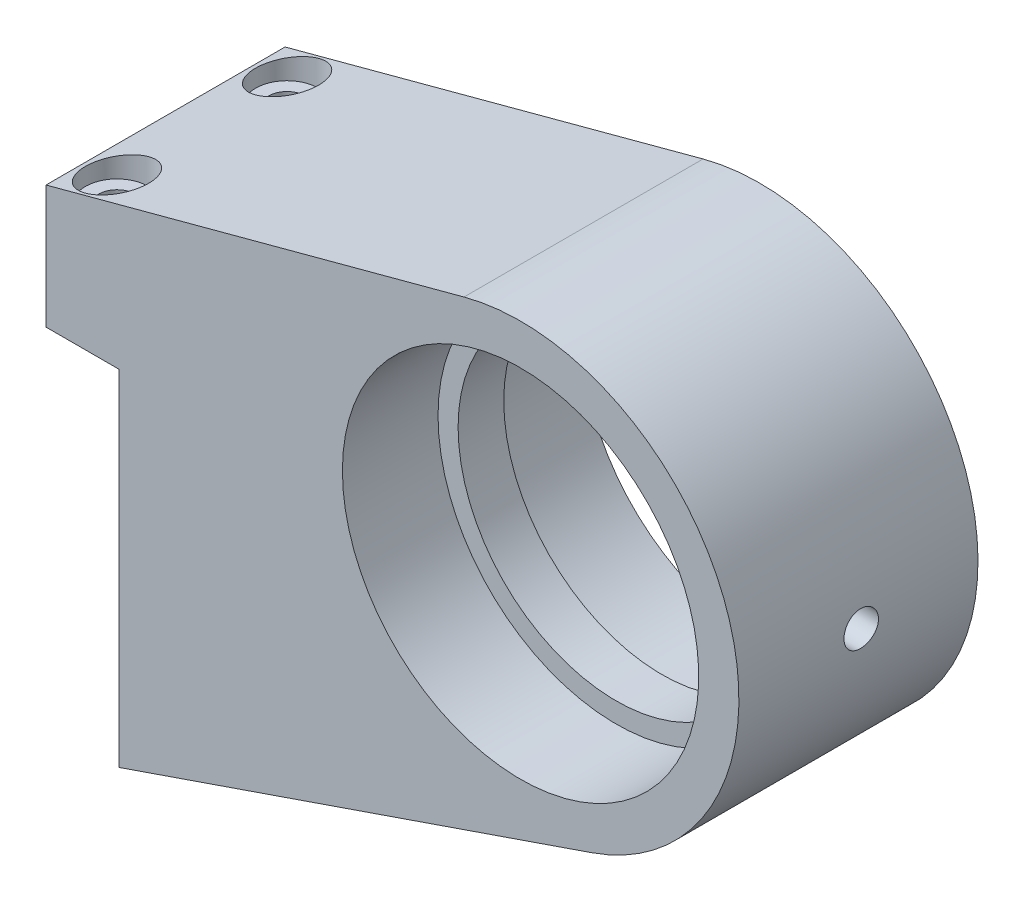
ISO-10303-21;
HEADER;
FILE_DESCRIPTION(('STEP AP214'),'2;1');
FILE_NAME('part.step','',(''),(''),'','','');
FILE_SCHEMA(('AUTOMOTIVE_DESIGN { 1 0 10303 214 1 1 1 1 }'));
ENDSEC;
DATA;
#1=APPLICATION_CONTEXT('core data for automotive mechanical design processes');
#2=APPLICATION_PROTOCOL_DEFINITION('international standard','automotive_design',2000,#1);
#3=PRODUCT_CONTEXT('',#1,'mechanical');
#4=PRODUCT('Part','Part','',(#3));
#5=PRODUCT_RELATED_PRODUCT_CATEGORY('part','',(#4));
#6=PRODUCT_DEFINITION_FORMATION('','',#4);
#7=PRODUCT_DEFINITION_CONTEXT('part definition',#1,'design');
#8=PRODUCT_DEFINITION('design','',#6,#7);
#9=PRODUCT_DEFINITION_SHAPE('','',#8);
#10=(LENGTH_UNIT() NAMED_UNIT(*) SI_UNIT(.MILLI.,.METRE.));
#11=(NAMED_UNIT(*) PLANE_ANGLE_UNIT() SI_UNIT($,.RADIAN.));
#12=(NAMED_UNIT(*) SI_UNIT($,.STERADIAN.) SOLID_ANGLE_UNIT());
#13=UNCERTAINTY_MEASURE_WITH_UNIT(LENGTH_MEASURE(1.E-05),#10,'distance_accuracy_value','');
#14=(GEOMETRIC_REPRESENTATION_CONTEXT(3) GLOBAL_UNCERTAINTY_ASSIGNED_CONTEXT((#13)) GLOBAL_UNIT_ASSIGNED_CONTEXT((#10,
#11,#12)) REPRESENTATION_CONTEXT('',''));
#15=CARTESIAN_POINT('',(0.,0.,0.));
#16=DIRECTION('',(0.,0.,1.));
#17=DIRECTION('',(1.,0.,0.));
#18=AXIS2_PLACEMENT_3D('',#15,#16,#17);
#19=CARTESIAN_POINT('',(-210.619690711645,105.906843019026,41.6));
#20=DIRECTION('',(1.,0.,0.));
#21=DIRECTION('',(0.,0.,-1.));
#22=AXIS2_PLACEMENT_3D('',#19,#20,#21);
#23=PLANE('',#22);
#24=DIRECTION('',(0.,0.,-1.));
#25=VECTOR('',#24,1.);
#26=CARTESIAN_POINT('',(-210.619690711645,105.906843019026,32.5053390593276));
#27=LINE('',#26,#25);
#28=CARTESIAN_POINT('',(-210.619690711645,105.906843019026,41.6));
#29=VERTEX_POINT('',#28);
#30=CARTESIAN_POINT('',(-210.619690711645,105.906843019026,0.));
#31=VERTEX_POINT('',#30);
#32=EDGE_CURVE('E98',#29,#31,#27,.T.);
#33=ORIENTED_EDGE('',*,*,#32,.F.);
#34=DIRECTION('',(0.,-1.,0.));
#35=VECTOR('',#34,1.);
#36=CARTESIAN_POINT('',(-210.619690711645,105.906843019026,41.6));
#37=LINE('',#36,#35);
#38=CARTESIAN_POINT('',(-210.619690711645,127.324395561206,41.6));
#39=VERTEX_POINT('',#38);
#40=EDGE_CURVE('E691',#39,#29,#37,.T.);
#41=ORIENTED_EDGE('',*,*,#40,.F.);
#42=DIRECTION('',(0.,0.,1.));
#43=VECTOR('',#42,1.);
#44=CARTESIAN_POINT('',(-210.619690711645,127.324395561206,41.6));
#45=LINE('',#44,#43);
#46=CARTESIAN_POINT('',(-210.619690711645,127.324395561206,0.));
#47=VERTEX_POINT('',#46);
#48=EDGE_CURVE('E82',#39,#47,#45,.F.);
#49=ORIENTED_EDGE('',*,*,#48,.T.);
#50=DIRECTION('',(0.,1.,0.));
#51=VECTOR('',#50,1.);
#52=CARTESIAN_POINT('',(-210.619690711645,105.906843019026,0.));
#53=LINE('',#52,#51);
#54=EDGE_CURVE('E328',#31,#47,#53,.T.);
#55=ORIENTED_EDGE('',*,*,#54,.F.);
#56=EDGE_LOOP('',(#33,#41,#49,#55));
#57=FACE_BOUND('',#56,.T.);
#58=ADVANCED_FACE('F44',(#57),#23,.F.);
#59=CARTESIAN_POINT('',(-90.0503522781823,78.412182078353,0.));
#60=DIRECTION('',(0.,0.707106781186552,0.707106781186544));
#61=DIRECTION('',(0.,-0.707106781186544,0.707106781186552));
#62=AXIS2_PLACEMENT_3D('',#59,#60,#61);
#63=PLANE('',#62);
#64=DIRECTION('',(0.,-0.707106781186543,0.707106781186552));
#65=VECTOR('',#64,1.);
#66=CARTESIAN_POINT('',(-197.919690711645,78.412182078353,0.));
#67=LINE('',#66,#65);
#68=CARTESIAN_POINT('',(-197.919690711645,78.412182078353,0.));
#69=VERTEX_POINT('',#68);
#70=CARTESIAN_POINT('',(-197.919690711645,45.9068430190258,32.5053390593276));
#71=VERTEX_POINT('',#70);
#72=EDGE_CURVE('E326',#69,#71,#67,.T.);
#73=ORIENTED_EDGE('',*,*,#72,.F.);
#74=DIRECTION('',(1.,0.,0.));
#75=VECTOR('',#74,1.);
#76=CARTESIAN_POINT('',(-128.050352278182,78.412182078353,0.));
#77=LINE('',#76,#75);
#78=CARTESIAN_POINT('',(-107.089511335592,78.412182078353,0.));
#79=VERTEX_POINT('',#78);
#80=EDGE_CURVE('E321',#69,#79,#77,.T.);
#81=ORIENTED_EDGE('',*,*,#80,.T.);
#82=CARTESIAN_POINT('',(-128.050352278182,110.108288258441,-31.6961061800888));
#83=DIRECTION('',(0.,0.707106781186552,0.707106781186544));
#84=DIRECTION('',(0.,0.707106781186544,-0.707106781186552));
#85=AXIS2_PLACEMENT_3D('',#82,#83,#84);
#86=ELLIPSE('',#85,53.7401153701779,38.);
#87=CARTESIAN_POINT('',(-115.696768034029,74.1723875973671,4.23979448098595));
#88=VERTEX_POINT('',#87);
#89=EDGE_CURVE('E336',#88,#79,#86,.T.);
#90=ORIENTED_EDGE('',*,*,#89,.F.);
#91=DIRECTION('',(-0.899350477500135,-0.309167202837135,0.309167202837139));
#92=VECTOR('',#91,1.);
#93=CARTESIAN_POINT('',(-115.696768034029,74.1723875973671,4.23979448098592));
#94=LINE('',#93,#92);
#95=EDGE_CURVE('E282',#88,#71,#94,.T.);
#96=ORIENTED_EDGE('',*,*,#95,.T.);
#97=EDGE_LOOP('',(#73,#81,#90,#96));
#98=FACE_BOUND('',#97,.T.);
#99=ADVANCED_FACE('F46',(#98),#63,.F.);
#100=CARTESIAN_POINT('',(-128.050352278182,110.108288258441,0.));
#101=DIRECTION('',(0.,0.,1.));
#102=DIRECTION('',(1.,0.,0.));
#103=AXIS2_PLACEMENT_3D('',#100,#101,#102);
#104=PLANE('',#103);
#105=CARTESIAN_POINT('',(-190.410297250705,84.4801271268031,0.));
#106=DIRECTION('',(0.,0.,-1.));
#107=DIRECTION('',(-1.,0.,0.));
#108=AXIS2_PLACEMENT_3D('',#105,#106,#107);
#109=CIRCLE('',#108,1.25);
#110=CARTESIAN_POINT('',(-191.660297250705,84.4801271268031,0.));
#111=VERTEX_POINT('',#110);
#112=EDGE_CURVE('E145',#111,#111,#109,.T.);
#113=ORIENTED_EDGE('',*,*,#112,.F.);
#114=EDGE_LOOP('',(#113));
#115=FACE_BOUND('',#114,.T.);
#116=CARTESIAN_POINT('',(-180.210297250705,106.730127126803,0.));
#117=DIRECTION('',(0.,0.,-1.));
#118=DIRECTION('',(-1.,0.,0.));
#119=AXIS2_PLACEMENT_3D('',#116,#117,#118);
#120=CIRCLE('',#119,1.25);
#121=CARTESIAN_POINT('',(-181.460297250705,106.730127126803,0.));
#122=VERTEX_POINT('',#121);
#123=EDGE_CURVE('E144',#122,#122,#120,.T.);
#124=ORIENTED_EDGE('',*,*,#123,.F.);
#125=EDGE_LOOP('',(#124));
#126=FACE_BOUND('',#125,.T.);
#127=CARTESIAN_POINT('',(-128.044290711645,110.052395561206,0.));
#128=DIRECTION('',(0.,0.,-1.));
#129=DIRECTION('',(-1.,0.,0.));
#130=AXIS2_PLACEMENT_3D('',#127,#128,#129);
#131=CIRCLE('',#130,31.0007);
#132=CARTESIAN_POINT('',(-159.044990711645,110.052395561206,0.));
#133=VERTEX_POINT('',#132);
#134=EDGE_CURVE('E632',#133,#133,#131,.T.);
#135=ORIENTED_EDGE('',*,*,#134,.F.);
#136=EDGE_LOOP('',(#135));
#137=FACE_BOUND('',#136,.T.);
#138=ORIENTED_EDGE('',*,*,#80,.F.);
#139=DIRECTION('',(0.,-1.,0.));
#140=VECTOR('',#139,1.);
#141=CARTESIAN_POINT('',(-197.919690711645,105.906843019026,0.));
#142=LINE('',#141,#140);
#143=CARTESIAN_POINT('',(-197.919690711645,105.906843019026,0.));
#144=VERTEX_POINT('',#143);
#145=EDGE_CURVE('E90',#144,#69,#142,.T.);
#146=ORIENTED_EDGE('',*,*,#145,.F.);
#147=DIRECTION('',(1.,0.,0.));
#148=VECTOR('',#147,1.);
#149=CARTESIAN_POINT('',(-210.619690711645,105.906843019026,0.));
#150=LINE('',#149,#148);
#151=EDGE_CURVE('E643',#31,#144,#150,.T.);
#152=ORIENTED_EDGE('',*,*,#151,.F.);
#153=ORIENTED_EDGE('',*,*,#54,.T.);
#154=DIRECTION('',(0.965925826289069,0.258819045102518,0.));
#155=VECTOR('',#154,1.);
#156=CARTESIAN_POINT('',(-210.619690711645,127.324395561206,0.));
#157=LINE('',#156,#155);
#158=CARTESIAN_POINT('',(-137.885475992078,146.813469657426,0.));
#159=VERTEX_POINT('',#158);
#160=EDGE_CURVE('E284',#47,#159,#157,.T.);
#161=ORIENTED_EDGE('',*,*,#160,.T.);
#162=CARTESIAN_POINT('',(-128.050352278182,110.108288258441,0.));
#163=DIRECTION('',(0.,0.,-1.));
#164=DIRECTION('',(-1.,0.,0.));
#165=AXIS2_PLACEMENT_3D('',#162,#163,#164);
#166=CIRCLE('',#165,38.);
#167=EDGE_CURVE('E66',#79,#159,#166,.F.);
#168=ORIENTED_EDGE('',*,*,#167,.F.);
#169=EDGE_LOOP('',(#138,#146,#152,#153,#161,#168));
#170=FACE_BOUND('',#169,.T.);
#171=ADVANCED_FACE('F239',(#115,#126,#137,#170),#104,.F.);
#172=CARTESIAN_POINT('',(-197.919690711645,45.9068430190258,41.6));
#173=DIRECTION('',(-0.325094322214564,0.945681596344062,0.));
#174=DIRECTION('',(-0.945681596344062,-0.325094322214564,0.));
#175=AXIS2_PLACEMENT_3D('',#172,#173,#174);
#176=PLANE('',#175);
#177=DIRECTION('',(0.,0.,-1.));
#178=VECTOR('',#177,1.);
#179=CARTESIAN_POINT('',(-115.696768034029,74.1723875973671,41.6));
#180=LINE('',#179,#178);
#181=CARTESIAN_POINT('',(-115.696768034029,74.1723875973671,41.6));
#182=VERTEX_POINT('',#181);
#183=EDGE_CURVE('E58',#182,#88,#180,.T.);
#184=ORIENTED_EDGE('',*,*,#183,.F.);
#185=DIRECTION('',(0.945681596344062,0.325094322214563,0.));
#186=VECTOR('',#185,1.);
#187=CARTESIAN_POINT('',(-115.696768034029,74.1723875973671,41.6));
#188=LINE('',#187,#186);
#189=CARTESIAN_POINT('',(-197.919690711645,45.9068430190258,41.6));
#190=VERTEX_POINT('',#189);
#191=EDGE_CURVE('E699',#190,#182,#188,.T.);
#192=ORIENTED_EDGE('',*,*,#191,.F.);
#193=DIRECTION('',(0.,0.,-1.));
#194=VECTOR('',#193,1.);
#195=CARTESIAN_POINT('',(-197.919690711645,45.9068430190258,41.6));
#196=LINE('',#195,#194);
#197=EDGE_CURVE('E645',#190,#71,#196,.T.);
#198=ORIENTED_EDGE('',*,*,#197,.T.);
#199=ORIENTED_EDGE('',*,*,#95,.F.);
#200=EDGE_LOOP('',(#184,#192,#198,#199));
#201=FACE_BOUND('',#200,.T.);
#202=ADVANCED_FACE('F246',(#201),#176,.F.);
#203=CARTESIAN_POINT('',(-210.619690711645,127.324395561206,41.6));
#204=DIRECTION('',(0.258819045102518,-0.965925826289069,0.));
#205=DIRECTION('',(0.965925826289069,0.258819045102518,0.));
#206=AXIS2_PLACEMENT_3D('',#203,#204,#205);
#207=PLANE('',#206);
#208=CARTESIAN_POINT('',(-204.269690711645,129.025872933144,6.));
#209=DIRECTION('',(0.258819045102518,-0.965925826289069,0.));
#210=DIRECTION('',(0.965925826289069,0.258819045102518,0.));
#211=AXIS2_PLACEMENT_3D('',#208,#209,#210);
#212=ELLIPSE('',#211,5.69401899225546,5.50000000000001);
#213=CARTESIAN_POINT('',(-198.769690711645,130.499593491515,6.));
#214=VERTEX_POINT('',#213);
#215=EDGE_CURVE('E660',#214,#214,#212,.T.);
#216=ORIENTED_EDGE('',*,*,#215,.T.);
#217=EDGE_LOOP('',(#216));
#218=FACE_BOUND('',#217,.T.);
#219=CARTESIAN_POINT('',(-204.269690711645,129.025872933144,35.6));
#220=DIRECTION('',(0.258819045102518,-0.965925826289069,0.));
#221=DIRECTION('',(0.965925826289069,0.258819045102518,0.));
#222=AXIS2_PLACEMENT_3D('',#219,#220,#221);
#223=ELLIPSE('',#222,5.69401899225546,5.50000000000001);
#224=CARTESIAN_POINT('',(-198.769690711645,130.499593491515,35.6));
#225=VERTEX_POINT('',#224);
#226=EDGE_CURVE('E655',#225,#225,#223,.T.);
#227=ORIENTED_EDGE('',*,*,#226,.T.);
#228=EDGE_LOOP('',(#227));
#229=FACE_BOUND('',#228,.T.);
#230=ORIENTED_EDGE('',*,*,#48,.F.);
#231=DIRECTION('',(-0.965925826289069,-0.258819045102518,0.));
#232=VECTOR('',#231,1.);
#233=CARTESIAN_POINT('',(-210.619690711645,127.324395561206,41.6));
#234=LINE('',#233,#232);
#235=CARTESIAN_POINT('',(-137.885475992078,146.813469657426,41.6));
#236=VERTEX_POINT('',#235);
#237=EDGE_CURVE('E649',#236,#39,#234,.T.);
#238=ORIENTED_EDGE('',*,*,#237,.F.);
#239=DIRECTION('',(0.,0.,-1.));
#240=VECTOR('',#239,1.);
#241=CARTESIAN_POINT('',(-137.885475992078,146.813469657426,41.6));
#242=LINE('',#241,#240);
#243=EDGE_CURVE('E372',#159,#236,#242,.F.);
#244=ORIENTED_EDGE('',*,*,#243,.F.);
#245=ORIENTED_EDGE('',*,*,#160,.F.);
#246=EDGE_LOOP('',(#230,#238,#244,#245));
#247=FACE_BOUND('',#246,.T.);
#248=ADVANCED_FACE('F245',(#218,#229,#247),#207,.F.);
#249=CARTESIAN_POINT('',(-128.050352278182,110.108288258441,41.6));
#250=DIRECTION('',(0.,0.,-1.));
#251=DIRECTION('',(-1.,0.,0.));
#252=AXIS2_PLACEMENT_3D('',#249,#250,#251);
#253=CYLINDRICAL_SURFACE('',#252,38.);
#254=CARTESIAN_POINT('',(-90.0503522781822,110.108288258441,17.3201943677273));
#255=CARTESIAN_POINT('',(-90.0503538281288,110.276513055252,17.3221167685357));
#256=CARTESIAN_POINT('',(-90.0514812657626,110.444691696702,17.3382240715952));
#257=CARTESIAN_POINT('',(-90.0558577699489,110.776074558063,17.3984066147285));
#258=CARTESIAN_POINT('',(-90.0591092571643,110.939272879794,17.4425137630682));
#259=CARTESIAN_POINT('',(-90.0673539685502,111.255852154192,17.557413752208));
#260=CARTESIAN_POINT('',(-90.0723462218034,111.409238523184,17.6281917190506));
#261=CARTESIAN_POINT('',(-90.0835006508415,111.70191764995,17.7943995853256));
#262=CARTESIAN_POINT('',(-90.0896625717839,111.841213467603,17.8898241164911));
#263=CARTESIAN_POINT('',(-90.102469822882,112.102113989184,18.1028540249736));
#264=CARTESIAN_POINT('',(-90.1091161099451,112.223682167125,18.2205040827315));
#265=CARTESIAN_POINT('',(-90.1221250145657,112.445367662248,18.474546876798));
#266=CARTESIAN_POINT('',(-90.1284876199766,112.545484061616,18.6109404146373));
#267=CARTESIAN_POINT('',(-90.1402115194658,112.721533479008,18.8988029609529));
#268=CARTESIAN_POINT('',(-90.1455715831692,112.797436860993,19.0502901484164));
#269=CARTESIAN_POINT('',(-90.1546670777877,112.922717589681,19.3639079995216));
#270=CARTESIAN_POINT('',(-90.1584025350003,112.972095365758,19.526038490831));
#271=CARTESIAN_POINT('',(-90.1638141308663,113.042823412112,19.8559761221531));
#272=CARTESIAN_POINT('',(-90.1654946125544,113.064232798024,20.0237705174643));
#273=CARTESIAN_POINT('',(-90.1666179716663,113.078596380518,20.3605787149989));
#274=CARTESIAN_POINT('',(-90.1660608852593,113.071551037056,20.5295924974675));
#275=CARTESIAN_POINT('',(-90.1627766856726,113.029256405409,20.8636634356178));
#276=CARTESIAN_POINT('',(-90.160054195454,112.994067201194,21.0287282495485));
#277=CARTESIAN_POINT('',(-90.1527555861069,112.896573612451,21.3506022007378));
#278=CARTESIAN_POINT('',(-90.14817944924,112.834268968443,21.5074112589769));
#279=CARTESIAN_POINT('',(-90.1376874863943,112.684231395859,21.8085395679523));
#280=CARTESIAN_POINT('',(-90.1317700401173,112.596467676615,21.9528434185646));
#281=CARTESIAN_POINT('',(-90.1192707197395,112.398027004192,22.22469595366));
#282=CARTESIAN_POINT('',(-90.112688833957,112.287349648119,22.3522443434659));
#283=CARTESIAN_POINT('',(-90.0995895873883,112.045873400939,22.5873179519498));
#284=CARTESIAN_POINT('',(-90.0930724436517,111.91502199703,22.6947892474591));
#285=CARTESIAN_POINT('',(-90.0808639676414,111.637102309584,22.8862461675408));
#286=CARTESIAN_POINT('',(-90.0751726348479,111.490034036258,22.9702318068986));
#287=CARTESIAN_POINT('',(-90.0652683328053,111.183849042292,23.1123153422571));
#288=CARTESIAN_POINT('',(-90.0610552426456,111.024733308351,23.1704153556381));
#289=CARTESIAN_POINT('',(-90.0545943221535,110.69896560989,23.259062101946));
#290=CARTESIAN_POINT('',(-90.0523464549562,110.532313786798,23.289609351724));
#291=CARTESIAN_POINT('',(-90.0500856062289,110.196686366169,23.3222213640262));
#292=CARTESIAN_POINT('',(-90.050066609012,110.027718254642,23.3243627796002));
#293=CARTESIAN_POINT('',(-90.0522632176201,109.691828646071,23.3003000816202));
#294=CARTESIAN_POINT('',(-90.0544788073318,109.524907134278,23.2740961724622));
#295=CARTESIAN_POINT('',(-90.060904463996,109.198033146874,23.1941464569049));
#296=CARTESIAN_POINT('',(-90.0651123385954,109.038073221342,23.1404309195934));
#297=CARTESIAN_POINT('',(-90.0750625185133,108.72943657213,23.0070133417001));
#298=CARTESIAN_POINT('',(-90.0808048470239,108.580760019035,22.9273109083417));
#299=CARTESIAN_POINT('',(-90.0932073023857,108.298545100956,22.7439728072235));
#300=CARTESIAN_POINT('',(-90.0998694605847,108.16504146756,22.6402838154967));
#301=CARTESIAN_POINT('',(-90.1133646507299,107.917308462606,22.4119976978405));
#302=CARTESIAN_POINT('',(-90.1201976852524,107.80307938184,22.2874002565233));
#303=CARTESIAN_POINT('',(-90.1332899646742,107.596891718601,22.0205120659355));
#304=CARTESIAN_POINT('',(-90.1395479503484,107.504981318977,21.8781840229436));
#305=CARTESIAN_POINT('',(-90.1507725458998,107.34636745898,21.5800671729414));
#306=CARTESIAN_POINT('',(-90.1557391690354,107.279663739811,21.424278504151));
#307=CARTESIAN_POINT('',(-90.1638166604246,107.173450485993,21.1038709987155));
#308=CARTESIAN_POINT('',(-90.1669299499065,107.133905460311,20.9392639904847));
#309=CARTESIAN_POINT('',(-90.170959654513,107.083015182531,20.6057215158885));
#310=CARTESIAN_POINT('',(-90.1718761073746,107.071669446029,20.4367861239261));
#311=CARTESIAN_POINT('',(-90.1714093185611,107.07749850466,20.0998810058637));
#312=CARTESIAN_POINT('',(-90.1700324326297,107.09459447648,19.9319099011911));
#313=CARTESIAN_POINT('',(-90.1651459592129,107.156661843326,19.6012323053587));
#314=CARTESIAN_POINT('',(-90.161636366575,107.201633305699,19.4385258269193));
#315=CARTESIAN_POINT('',(-90.1528775238985,107.318163037316,19.1229667373696));
#316=CARTESIAN_POINT('',(-90.1476281264549,107.389723559381,18.9701149625105));
#317=CARTESIAN_POINT('',(-90.1359756434893,107.557391088619,18.6785811762003));
#318=CARTESIAN_POINT('',(-90.1295725782365,107.653497664546,18.5398989158667));
#319=CARTESIAN_POINT('',(-90.1163054978237,107.867836626848,18.2802331226578));
#320=CARTESIAN_POINT('',(-90.1094402869526,107.986127942064,18.1592982932317));
#321=CARTESIAN_POINT('',(-90.09602567156,108.241368711109,17.9389539286836));
#322=CARTESIAN_POINT('',(-90.0894763439256,108.378322676769,17.839549613813));
#323=CARTESIAN_POINT('',(-90.0774108960275,108.667230697777,17.6649757809305));
#324=CARTESIAN_POINT('',(-90.0718965063405,108.819209240106,17.5898467061761));
#325=CARTESIAN_POINT('',(-90.0625314062073,109.133562269062,17.4662701523483));
#326=CARTESIAN_POINT('',(-90.0586787750395,109.295924503131,17.4177918514347));
#327=CARTESIAN_POINT('',(-90.054051956486,109.567423665344,17.3611042048466));
#328=CARTESIAN_POINT('',(-90.0526699908096,109.674909348403,17.3447010073563));
#329=CARTESIAN_POINT('',(-90.0508196523858,109.891032522947,17.3236254816556));
#330=CARTESIAN_POINT('',(-90.0503512774232,109.999670011639,17.3189531250007));
#331=CARTESIAN_POINT('',(-90.0503522781822,110.108288258441,17.3201943677273));
#332=B_SPLINE_CURVE_WITH_KNOTS('',3,(#254,#255,#256,#257,#258,#259,#260,#261,#262,#263,#264,
#265,#266,#267,#268,#269,#270,#271,#272,#273,#274,#275,#276,#277,#278,#279,#280,#281,#282,#283,
#284,#285,#286,#287,#288,#289,#290,#291,#292,#293,#294,#295,#296,#297,#298,#299,#300,#301,#302,
#303,#304,#305,#306,#307,#308,#309,#310,#311,#312,#313,#314,#315,#316,#317,#318,#319,#320,#321,
#322,#323,#324,#325,#326,#327,#328,#329,#330,#331),.UNSPECIFIED.,.T.,.F.,(4,2,2,2,2,2,2,2,2,2,2,
2,2,2,2,2,2,2,2,2,2,2,2,2,2,2,2,2,2,2,2,2,2,2,2,2,2,2,4),(0.,0.504310734222346,1.00919720873409,
1.51380253054979,2.01829803685427,2.5238187468181,3.0293610811835,3.53551983158805,
4.04167038849052,4.54674937552922,5.05182019826605,5.55581562080273,6.05981586642298,
6.56442821868621,7.06904944434745,7.57500708875191,8.08096441463088,8.58688034684798,
9.09278678859342,9.59732776489254,10.1018651030092,10.6058485232363,11.1098395612269,
11.6149619641356,12.1200919871125,12.6263030074413,13.1325088303796,13.638051877365,
14.1435862401188,14.6477218982302,15.1518587743475,15.6560383743995,16.1602091171922,
16.6657385489163,17.1713904135712,17.6778804165224,18.1837834206743,18.5094041475551,
18.8350240848856),.UNSPECIFIED.);
#333=CARTESIAN_POINT('',(-90.0503522781822,110.108288258441,17.3201943677273));
#334=VERTEX_POINT('',#333);
#335=EDGE_CURVE('E13',#334,#334,#332,.T.);
#336=ORIENTED_EDGE('',*,*,#335,.F.);
#337=EDGE_LOOP('',(#336));
#338=FACE_BOUND('',#337,.T.);
#339=ORIENTED_EDGE('',*,*,#243,.T.);
#340=CARTESIAN_POINT('',(-128.050352278182,110.108288258441,41.6));
#341=DIRECTION('',(0.,0.,1.));
#342=DIRECTION('',(-1.,0.,0.));
#343=AXIS2_PLACEMENT_3D('',#340,#341,#342);
#344=CIRCLE('',#343,38.);
#345=EDGE_CURVE('E702',#182,#236,#344,.T.);
#346=ORIENTED_EDGE('',*,*,#345,.F.);
#347=ORIENTED_EDGE('',*,*,#183,.T.);
#348=ORIENTED_EDGE('',*,*,#89,.T.);
#349=ORIENTED_EDGE('',*,*,#167,.T.);
#350=EDGE_LOOP('',(#339,#346,#347,#348,#349));
#351=FACE_BOUND('',#350,.T.);
#352=ADVANCED_FACE('F241',(#338,#351),#253,.T.);
#353=CARTESIAN_POINT('',(-197.919690711645,0.,0.));
#354=DIRECTION('',(-1.,0.,0.));
#355=DIRECTION('',(0.,0.,1.));
#356=AXIS2_PLACEMENT_3D('',#353,#354,#355);
#357=PLANE('',#356);
#358=CARTESIAN_POINT('',(-197.919690711645,67.9068430190258,20.8));
#359=DIRECTION('',(-1.,0.,0.));
#360=DIRECTION('',(0.,0.,1.));
#361=AXIS2_PLACEMENT_3D('',#358,#359,#360);
#362=CIRCLE('',#361,2.5);
#363=CARTESIAN_POINT('',(-197.919690711645,67.9068430190258,23.3));
#364=VERTEX_POINT('',#363);
#365=EDGE_CURVE('E162',#364,#364,#362,.T.);
#366=ORIENTED_EDGE('',*,*,#365,.F.);
#367=EDGE_LOOP('',(#366));
#368=FACE_BOUND('',#367,.T.);
#369=CARTESIAN_POINT('',(-197.919690711645,51.9068430190258,35.6));
#370=DIRECTION('',(-1.,0.,0.));
#371=DIRECTION('',(0.,0.,1.));
#372=AXIS2_PLACEMENT_3D('',#369,#370,#371);
#373=CIRCLE('',#372,2.5);
#374=CARTESIAN_POINT('',(-197.919690711645,51.9068430190258,38.1));
#375=VERTEX_POINT('',#374);
#376=EDGE_CURVE('E732',#375,#375,#373,.T.);
#377=ORIENTED_EDGE('',*,*,#376,.F.);
#378=EDGE_LOOP('',(#377));
#379=FACE_BOUND('',#378,.T.);
#380=CARTESIAN_POINT('',(-197.919690711645,75.9068430190258,35.6));
#381=DIRECTION('',(-1.,0.,0.));
#382=DIRECTION('',(0.,0.,1.));
#383=AXIS2_PLACEMENT_3D('',#380,#381,#382);
#384=CIRCLE('',#383,2.5);
#385=CARTESIAN_POINT('',(-197.919690711645,75.9068430190258,38.1));
#386=VERTEX_POINT('',#385);
#387=EDGE_CURVE('E726',#386,#386,#384,.T.);
#388=ORIENTED_EDGE('',*,*,#387,.F.);
#389=EDGE_LOOP('',(#388));
#390=FACE_BOUND('',#389,.T.);
#391=ORIENTED_EDGE('',*,*,#72,.T.);
#392=ORIENTED_EDGE('',*,*,#197,.F.);
#393=DIRECTION('',(0.,-1.,0.));
#394=VECTOR('',#393,1.);
#395=CARTESIAN_POINT('',(-197.919690711645,45.9068430190258,41.6));
#396=LINE('',#395,#394);
#397=CARTESIAN_POINT('',(-197.919690711645,105.906843019026,41.6));
#398=VERTEX_POINT('',#397);
#399=EDGE_CURVE('E697',#398,#190,#396,.T.);
#400=ORIENTED_EDGE('',*,*,#399,.F.);
#401=DIRECTION('',(0.,0.,1.));
#402=VECTOR('',#401,1.);
#403=CARTESIAN_POINT('',(-197.919690711645,105.906843019026,0.));
#404=LINE('',#403,#402);
#405=EDGE_CURVE('E640',#144,#398,#404,.T.);
#406=ORIENTED_EDGE('',*,*,#405,.F.);
#407=ORIENTED_EDGE('',*,*,#145,.T.);
#408=EDGE_LOOP('',(#391,#392,#400,#406,#407));
#409=FACE_BOUND('',#408,.T.);
#410=ADVANCED_FACE('F451',(#368,#379,#390,#409),#357,.T.);
#411=CARTESIAN_POINT('',(0.,105.906843019026,0.));
#412=DIRECTION('',(0.,-1.,0.));
#413=DIRECTION('',(0.,0.,-1.));
#414=AXIS2_PLACEMENT_3D('',#411,#412,#413);
#415=PLANE('',#414);
#416=CARTESIAN_POINT('',(-204.269690711645,105.906843019026,6.));
#417=DIRECTION('',(0.,-1.,0.));
#418=DIRECTION('',(0.,0.,-1.));
#419=AXIS2_PLACEMENT_3D('',#416,#417,#418);
#420=CIRCLE('',#419,3.19999999999999);
#421=CARTESIAN_POINT('',(-204.269690711645,105.906843019026,2.80000000000001));
#422=VERTEX_POINT('',#421);
#423=EDGE_CURVE('E662',#422,#422,#420,.T.);
#424=ORIENTED_EDGE('',*,*,#423,.F.);
#425=EDGE_LOOP('',(#424));
#426=FACE_BOUND('',#425,.T.);
#427=CARTESIAN_POINT('',(-204.269690711645,105.906843019026,35.6));
#428=DIRECTION('',(0.,-1.,0.));
#429=DIRECTION('',(0.,0.,-1.));
#430=AXIS2_PLACEMENT_3D('',#427,#428,#429);
#431=CIRCLE('',#430,3.19999999999999);
#432=CARTESIAN_POINT('',(-204.269690711645,105.906843019026,32.4));
#433=VERTEX_POINT('',#432);
#434=EDGE_CURVE('E652',#433,#433,#431,.T.);
#435=ORIENTED_EDGE('',*,*,#434,.F.);
#436=EDGE_LOOP('',(#435));
#437=FACE_BOUND('',#436,.T.);
#438=ORIENTED_EDGE('',*,*,#151,.T.);
#439=ORIENTED_EDGE('',*,*,#405,.T.);
#440=DIRECTION('',(1.,0.,0.));
#441=VECTOR('',#440,1.);
#442=CARTESIAN_POINT('',(-197.919690711645,105.906843019026,41.6));
#443=LINE('',#442,#441);
#444=EDGE_CURVE('E694',#29,#398,#443,.T.);
#445=ORIENTED_EDGE('',*,*,#444,.F.);
#446=ORIENTED_EDGE('',*,*,#32,.T.);
#447=EDGE_LOOP('',(#438,#439,#445,#446));
#448=FACE_BOUND('',#447,.T.);
#449=ADVANCED_FACE('F418',(#426,#437,#448),#415,.T.);
#450=CARTESIAN_POINT('',(-128.050352278182,110.108288258441,41.6));
#451=DIRECTION('',(0.,0.,-1.));
#452=DIRECTION('',(-1.,0.,0.));
#453=AXIS2_PLACEMENT_3D('',#450,#451,#452);
#454=PLANE('',#453);
#455=CARTESIAN_POINT('',(-128.044290711645,110.052395561206,41.6));
#456=DIRECTION('',(0.,0.,-1.));
#457=DIRECTION('',(-1.,0.,0.));
#458=AXIS2_PLACEMENT_3D('',#455,#456,#457);
#459=CIRCLE('',#458,31.0007);
#460=CARTESIAN_POINT('',(-159.044990711645,110.052395561206,41.6));
#461=VERTEX_POINT('',#460);
#462=EDGE_CURVE('E688',#461,#461,#459,.T.);
#463=ORIENTED_EDGE('',*,*,#462,.T.);
#464=EDGE_LOOP('',(#463));
#465=FACE_BOUND('',#464,.T.);
#466=ORIENTED_EDGE('',*,*,#40,.T.);
#467=ORIENTED_EDGE('',*,*,#444,.T.);
#468=ORIENTED_EDGE('',*,*,#399,.T.);
#469=ORIENTED_EDGE('',*,*,#191,.T.);
#470=ORIENTED_EDGE('',*,*,#345,.T.);
#471=ORIENTED_EDGE('',*,*,#237,.T.);
#472=EDGE_LOOP('',(#466,#467,#468,#469,#470,#471));
#473=FACE_BOUND('',#472,.T.);
#474=ADVANCED_FACE('F473',(#465,#473),#454,.F.);
#475=CARTESIAN_POINT('',(-128.044290711645,110.052395561206,41.6));
#476=DIRECTION('',(0.,0.,-1.));
#477=DIRECTION('',(-1.,0.,0.));
#478=AXIS2_PLACEMENT_3D('',#475,#476,#477);
#479=CYLINDRICAL_SURFACE('',#478,31.0007);
#480=ORIENTED_EDGE('',*,*,#462,.F.);
#481=EDGE_LOOP('',(#480));
#482=FACE_BOUND('',#481,.T.);
#483=CARTESIAN_POINT('',(-128.044290711645,110.052395561206,24.963));
#484=DIRECTION('',(0.,0.,-1.));
#485=DIRECTION('',(-1.,0.,0.));
#486=AXIS2_PLACEMENT_3D('',#483,#484,#485);
#487=CIRCLE('',#486,31.0007);
#488=CARTESIAN_POINT('',(-159.044990711645,110.052395561206,24.963));
#489=VERTEX_POINT('',#488);
#490=EDGE_CURVE('E659',#489,#489,#487,.T.);
#491=ORIENTED_EDGE('',*,*,#490,.T.);
#492=EDGE_LOOP('',(#491));
#493=FACE_BOUND('',#492,.T.);
#494=ADVANCED_FACE('F482',(#482,#493),#479,.F.);
#495=CARTESIAN_POINT('',(-128.044290711645,110.052395561206,41.6));
#496=DIRECTION('',(0.,0.,-1.));
#497=DIRECTION('',(-1.,0.,0.));
#498=AXIS2_PLACEMENT_3D('',#495,#496,#497);
#499=CYLINDRICAL_SURFACE('',#498,31.0007);
#500=CARTESIAN_POINT('',(-128.044290711645,110.052395561206,17.018));
#501=DIRECTION('',(0.,0.,-1.));
#502=DIRECTION('',(-1.,0.,0.));
#503=AXIS2_PLACEMENT_3D('',#500,#501,#502);
#504=CIRCLE('',#503,31.0007);
#505=CARTESIAN_POINT('',(-159.044990711645,110.052395561206,17.018));
#506=VERTEX_POINT('',#505);
#507=EDGE_CURVE('E684',#506,#506,#504,.T.);
#508=ORIENTED_EDGE('',*,*,#507,.F.);
#509=EDGE_LOOP('',(#508));
#510=FACE_BOUND('',#509,.T.);
#511=ORIENTED_EDGE('',*,*,#134,.T.);
#512=EDGE_LOOP('',(#511));
#513=FACE_BOUND('',#512,.T.);
#514=ADVANCED_FACE('F491',(#510,#513),#499,.F.);
#515=CARTESIAN_POINT('',(-97.0435907116449,110.052395561206,17.018));
#516=DIRECTION('',(0.,0.,1.));
#517=DIRECTION('',(1.,0.,0.));
#518=AXIS2_PLACEMENT_3D('',#515,#516,#517);
#519=PLANE('',#518);
#520=CARTESIAN_POINT('',(-128.044290711645,110.052395561206,17.018));
#521=DIRECTION('',(0.,0.,-1.));
#522=DIRECTION('',(-1.,0.,0.));
#523=AXIS2_PLACEMENT_3D('',#520,#521,#522);
#524=CIRCLE('',#523,27.5082);
#525=CARTESIAN_POINT('',(-155.552490711645,110.052395561206,17.018));
#526=VERTEX_POINT('',#525);
#527=EDGE_CURVE('E681',#526,#526,#524,.T.);
#528=ORIENTED_EDGE('',*,*,#527,.F.);
#529=EDGE_LOOP('',(#528));
#530=FACE_BOUND('',#529,.T.);
#531=ORIENTED_EDGE('',*,*,#507,.T.);
#532=EDGE_LOOP('',(#531));
#533=FACE_BOUND('',#532,.T.);
#534=ADVANCED_FACE('F230',(#530,#533),#519,.F.);
#535=CARTESIAN_POINT('',(-128.044290711645,110.052395561206,41.6));
#536=DIRECTION('',(0.,0.,-1.));
#537=DIRECTION('',(-1.,0.,0.));
#538=AXIS2_PLACEMENT_3D('',#535,#536,#537);
#539=CYLINDRICAL_SURFACE('',#538,27.5082);
#540=CARTESIAN_POINT('',(-100.536099305069,110.074139047838,23.32));
#541=CARTESIAN_POINT('',(-100.535968624448,109.906171817352,23.3199927713971));
#542=CARTESIAN_POINT('',(-100.53738842785,109.738094410462,23.3058459944145));
#543=CARTESIAN_POINT('',(-100.543170957297,109.40660266508,23.2496273790169));
#544=CARTESIAN_POINT('',(-100.547536865734,109.243193568477,23.2075253440432));
#545=CARTESIAN_POINT('',(-100.55870838045,108.925886451785,23.0966405259209));
#546=CARTESIAN_POINT('',(-100.56551246182,108.771982557223,23.0278744171124));
#547=CARTESIAN_POINT('',(-100.580790622701,108.47793205401,22.865647174245));
#548=CARTESIAN_POINT('',(-100.589264385626,108.337782844879,22.7721907205602));
#549=CARTESIAN_POINT('',(-100.606964407013,108.074598211104,22.5628144649052));
#550=CARTESIAN_POINT('',(-100.616193366167,107.95162888116,22.4468118029184));
#551=CARTESIAN_POINT('',(-100.634334289496,107.726862661352,22.1958133568102));
#552=CARTESIAN_POINT('',(-100.643246238481,107.625066784959,22.0608166640549));
#553=CARTESIAN_POINT('',(-100.659764363251,107.445292996276,21.7752349266504));
#554=CARTESIAN_POINT('',(-100.667367125945,107.367376939558,21.6246107292888));
#555=CARTESIAN_POINT('',(-100.68036700746,107.237968121648,21.3123205660483));
#556=CARTESIAN_POINT('',(-100.685764189377,107.186474604562,21.150654916192));
#557=CARTESIAN_POINT('',(-100.693714311495,107.111568177413,20.8215414705525));
#558=CARTESIAN_POINT('',(-100.696278297723,107.088046184799,20.6541187735178));
#559=CARTESIAN_POINT('',(-100.698304222431,107.069413351013,20.3176838528858));
#560=CARTESIAN_POINT('',(-100.697766255789,107.074301640872,20.148671678063));
#561=CARTESIAN_POINT('',(-100.693659569392,107.112260140912,19.8146163476886));
#562=CARTESIAN_POINT('',(-100.690103802704,107.145209907098,19.6495593243899));
#563=CARTESIAN_POINT('',(-100.680384582565,107.238168515217,19.3273316124028));
#564=CARTESIAN_POINT('',(-100.674221088147,107.298177782268,19.1701610476576));
#565=CARTESIAN_POINT('',(-100.659970032558,107.443683966847,18.8677892960115));
#566=CARTESIAN_POINT('',(-100.651878470843,107.529233973432,18.7226138526723));
#567=CARTESIAN_POINT('',(-100.63469197251,107.723355428465,18.4486353327342));
#568=CARTESIAN_POINT('',(-100.625597001395,107.831927668529,18.3198328193591));
#569=CARTESIAN_POINT('',(-100.607378262195,108.069681107033,18.0815588681908));
#570=CARTESIAN_POINT('',(-100.598254588397,108.198965972289,17.9721908365633));
#571=CARTESIAN_POINT('',(-100.581059487097,108.474115911176,17.7766936172001));
#572=CARTESIAN_POINT('',(-100.572988060697,108.619981002193,17.6905644538302));
#573=CARTESIAN_POINT('',(-100.558813723033,108.924216321809,17.5439972350864));
#574=CARTESIAN_POINT('',(-100.552711136966,109.082588610885,17.4835634233599));
#575=CARTESIAN_POINT('',(-100.543176206017,109.407313427091,17.390173588238));
#576=CARTESIAN_POINT('',(-100.539743766224,109.573665670347,17.3572165881655));
#577=CARTESIAN_POINT('',(-100.535958399933,109.908722381915,17.3198486326277));
#578=CARTESIAN_POINT('',(-100.535589905179,110.077410590832,17.3152933941586));
#579=CARTESIAN_POINT('',(-100.537943995188,110.413146018139,17.3344774433336));
#580=CARTESIAN_POINT('',(-100.540666531475,110.580193262224,17.3582162872454));
#581=CARTESIAN_POINT('',(-100.548898012455,110.907497471979,17.4331963672028));
#582=CARTESIAN_POINT('',(-100.554400254969,111.06776977024,17.4843714694714));
#583=CARTESIAN_POINT('',(-100.567585495454,111.377454880982,17.6127018197492));
#584=CARTESIAN_POINT('',(-100.575268551905,111.526867402123,17.6898577644476));
#585=CARTESIAN_POINT('',(-100.592006929623,111.81125376436,17.8683215342));
#586=CARTESIAN_POINT('',(-100.601067659669,111.946166951217,17.9697254980607));
#587=CARTESIAN_POINT('',(-100.619536680527,112.197109009124,18.1936695314931));
#588=CARTESIAN_POINT('',(-100.628944981765,112.313137313114,18.3162102355136));
#589=CARTESIAN_POINT('',(-100.647104149947,112.523521646572,18.57958285486));
#590=CARTESIAN_POINT('',(-100.655852019659,112.617782453343,18.7204910703507));
#591=CARTESIAN_POINT('',(-100.671659722629,112.781299592661,19.0162249484875));
#592=CARTESIAN_POINT('',(-100.678719583413,112.850556332969,19.1710503841225));
#593=CARTESIAN_POINT('',(-100.690336905746,112.961936591619,19.4898916314192));
#594=CARTESIAN_POINT('',(-100.694899680399,113.004117752623,19.6538871052826));
#595=CARTESIAN_POINT('',(-100.701025208579,113.060336970564,19.9866860028182));
#596=CARTESIAN_POINT('',(-100.702588067444,113.074376015695,20.155489257457));
#597=CARTESIAN_POINT('',(-100.702535233767,113.073897281157,20.4921514387452));
#598=CARTESIAN_POINT('',(-100.700936433999,113.059531270056,20.660010604366));
#599=CARTESIAN_POINT('',(-100.69477557742,113.002969521429,20.990914667047));
#600=CARTESIAN_POINT('',(-100.690213518393,112.960773763095,21.1539595605075));
#601=CARTESIAN_POINT('',(-100.678642215294,112.849794205974,21.4705991789202));
#602=CARTESIAN_POINT('',(-100.671633472075,112.781015848521,21.6241958304293));
#603=CARTESIAN_POINT('',(-100.655952985369,112.618838951832,21.9176901278578));
#604=CARTESIAN_POINT('',(-100.647281240334,112.525440389681,22.0575877610263));
#605=CARTESIAN_POINT('',(-100.629190100938,112.316106720618,22.3204901814008));
#606=CARTESIAN_POINT('',(-100.619767098791,112.200058440853,22.4434046110577));
#607=CARTESIAN_POINT('',(-100.601259470202,111.94894994266,22.6680780472783));
#608=CARTESIAN_POINT('',(-100.592174925044,111.813885194025,22.7698319985289));
#609=CARTESIAN_POINT('',(-100.575329519029,111.528122710809,22.9495469227578));
#610=CARTESIAN_POINT('',(-100.567572731458,111.377379072715,23.0274352385177));
#611=CARTESIAN_POINT('',(-100.554290213351,111.064959674506,23.1566864980898));
#612=CARTESIAN_POINT('',(-100.548762000019,110.903296315605,23.2080789781289));
#613=CARTESIAN_POINT('',(-100.541931124269,110.629643142915,23.2702396869366));
#614=CARTESIAN_POINT('',(-100.539831282223,110.519395737457,23.2888737725422));
#615=CARTESIAN_POINT('',(-100.536958828909,110.297494807887,23.3137563008525));
#616=CARTESIAN_POINT('',(-100.536186210822,110.185841291003,23.3200048071945));
#617=CARTESIAN_POINT('',(-100.536099305069,110.074139047838,23.32));
#618=B_SPLINE_CURVE_WITH_KNOTS('',3,(#540,#541,#542,#543,#544,#545,#546,#547,#548,#549,#550,
#551,#552,#553,#554,#555,#556,#557,#558,#559,#560,#561,#562,#563,#564,#565,#566,#567,#568,#569,
#570,#571,#572,#573,#574,#575,#576,#577,#578,#579,#580,#581,#582,#583,#584,#585,#586,#587,#588,
#589,#590,#591,#592,#593,#594,#595,#596,#597,#598,#599,#600,#601,#602,#603,#604,#605,#606,#607,
#608,#609,#610,#611,#612,#613,#614,#615,#616,#617),.UNSPECIFIED.,.T.,.F.,(4,2,2,2,2,2,2,2,2,2,2,
2,2,2,2,2,2,2,2,2,2,2,2,2,2,2,2,2,2,2,2,2,2,2,2,2,2,2,4),(0.,0.503493946562556,1.00753264116407,
1.51125664291856,2.01488522570369,2.52040095060892,3.02594086653595,3.53277941887046,
4.03960347081167,4.54444447437825,5.04927003674281,5.55193967077075,6.05461720226458,
6.55834696302328,7.06209404724905,7.56844603428192,8.07479855222036,8.58123466301028,
9.08765277150616,9.59149612909101,10.0953315850715,10.5979579946773,11.1005978835339,
11.6052646888148,12.1099466450141,12.6167962079813,13.1236375049573,13.629396149578,
14.1351370344887,14.6381830410673,15.1412294237763,15.6441728897425,16.1471168238319,
16.6526412877556,17.1582863848692,17.6654559278353,18.1720588745245,18.5068961642741,
18.8417317336183),.UNSPECIFIED.);
#619=CARTESIAN_POINT('',(-100.536099305069,110.074139047838,23.32));
#620=VERTEX_POINT('',#619);
#621=EDGE_CURVE('E155',#620,#620,#618,.T.);
#622=ORIENTED_EDGE('',*,*,#621,.T.);
#623=EDGE_LOOP('',(#622));
#624=FACE_BOUND('',#623,.T.);
#625=CARTESIAN_POINT('',(-128.044290711645,110.052395561206,24.963));
#626=DIRECTION('',(0.,0.,-1.));
#627=DIRECTION('',(-1.,0.,0.));
#628=AXIS2_PLACEMENT_3D('',#625,#626,#627);
#629=CIRCLE('',#628,27.5082);
#630=CARTESIAN_POINT('',(-155.552490711645,110.052395561206,24.963));
#631=VERTEX_POINT('',#630);
#632=EDGE_CURVE('E678',#631,#631,#629,.T.);
#633=ORIENTED_EDGE('',*,*,#632,.F.);
#634=EDGE_LOOP('',(#633));
#635=FACE_BOUND('',#634,.T.);
#636=ORIENTED_EDGE('',*,*,#527,.T.);
#637=EDGE_LOOP('',(#636));
#638=FACE_BOUND('',#637,.T.);
#639=ADVANCED_FACE('F164',(#624,#635,#638),#539,.F.);
#640=CARTESIAN_POINT('',(-100.536090711645,110.052395561206,24.963));
#641=DIRECTION('',(0.,0.,-1.));
#642=DIRECTION('',(-1.,0.,0.));
#643=AXIS2_PLACEMENT_3D('',#640,#641,#642);
#644=PLANE('',#643);
#645=ORIENTED_EDGE('',*,*,#490,.F.);
#646=EDGE_LOOP('',(#645));
#647=FACE_BOUND('',#646,.T.);
#648=ORIENTED_EDGE('',*,*,#632,.T.);
#649=EDGE_LOOP('',(#648));
#650=FACE_BOUND('',#649,.T.);
#651=ADVANCED_FACE('F218',(#647,#650),#644,.F.);
#652=CARTESIAN_POINT('',(-204.269690711645,130.526388410758,35.6));
#653=DIRECTION('',(0.,1.,0.));
#654=DIRECTION('',(0.,0.,1.));
#655=AXIS2_PLACEMENT_3D('',#652,#653,#654);
#656=CYLINDRICAL_SURFACE('',#655,5.50000000000001);
#657=CARTESIAN_POINT('',(-204.269690711645,124.526388410758,35.6));
#658=DIRECTION('',(0.,1.,0.));
#659=DIRECTION('',(0.,0.,1.));
#660=AXIS2_PLACEMENT_3D('',#657,#658,#659);
#661=CIRCLE('',#660,5.50000000000001);
#662=CARTESIAN_POINT('',(-204.269690711645,124.526388410758,41.1));
#663=VERTEX_POINT('',#662);
#664=EDGE_CURVE('E665',#663,#663,#661,.T.);
#665=ORIENTED_EDGE('',*,*,#664,.F.);
#666=EDGE_LOOP('',(#665));
#667=FACE_BOUND('',#666,.T.);
#668=ORIENTED_EDGE('',*,*,#226,.F.);
#669=EDGE_LOOP('',(#668));
#670=FACE_BOUND('',#669,.T.);
#671=ADVANCED_FACE('F214',(#667,#670),#656,.F.);
#672=CARTESIAN_POINT('',(-204.269690711645,130.526388410758,35.6));
#673=DIRECTION('',(0.,1.,0.));
#674=DIRECTION('',(0.,0.,1.));
#675=AXIS2_PLACEMENT_3D('',#672,#673,#674);
#676=CYLINDRICAL_SURFACE('',#675,3.19999999999999);
#677=ORIENTED_EDGE('',*,*,#434,.T.);
#678=EDGE_LOOP('',(#677));
#679=FACE_BOUND('',#678,.T.);
#680=CARTESIAN_POINT('',(-204.269690711645,124.526388410758,35.6));
#681=DIRECTION('',(0.,1.,0.));
#682=DIRECTION('',(0.,0.,1.));
#683=AXIS2_PLACEMENT_3D('',#680,#681,#682);
#684=CIRCLE('',#683,3.20000000000001);
#685=CARTESIAN_POINT('',(-204.269690711645,124.526388410758,38.8));
#686=VERTEX_POINT('',#685);
#687=EDGE_CURVE('E656',#686,#686,#684,.T.);
#688=ORIENTED_EDGE('',*,*,#687,.T.);
#689=EDGE_LOOP('',(#688));
#690=FACE_BOUND('',#689,.T.);
#691=ADVANCED_FACE('F217',(#679,#690),#676,.F.);
#692=CARTESIAN_POINT('',(-201.069690711645,124.526388410758,35.6));
#693=DIRECTION('',(0.,-1.,0.));
#694=DIRECTION('',(0.,0.,-1.));
#695=AXIS2_PLACEMENT_3D('',#692,#693,#694);
#696=PLANE('',#695);
#697=ORIENTED_EDGE('',*,*,#687,.F.);
#698=EDGE_LOOP('',(#697));
#699=FACE_BOUND('',#698,.T.);
#700=ORIENTED_EDGE('',*,*,#664,.T.);
#701=EDGE_LOOP('',(#700));
#702=FACE_BOUND('',#701,.T.);
#703=ADVANCED_FACE('F206',(#699,#702),#696,.F.);
#704=CARTESIAN_POINT('',(-204.269690711645,130.526388410758,6.));
#705=DIRECTION('',(0.,1.,0.));
#706=DIRECTION('',(0.,0.,1.));
#707=AXIS2_PLACEMENT_3D('',#704,#705,#706);
#708=CYLINDRICAL_SURFACE('',#707,5.50000000000001);
#709=CARTESIAN_POINT('',(-204.269690711645,124.526388410758,6.));
#710=DIRECTION('',(0.,1.,0.));
#711=DIRECTION('',(0.,0.,1.));
#712=AXIS2_PLACEMENT_3D('',#709,#710,#711);
#713=CIRCLE('',#712,5.50000000000001);
#714=CARTESIAN_POINT('',(-204.269690711645,124.526388410758,11.5));
#715=VERTEX_POINT('',#714);
#716=EDGE_CURVE('E720',#715,#715,#713,.T.);
#717=ORIENTED_EDGE('',*,*,#716,.F.);
#718=EDGE_LOOP('',(#717));
#719=FACE_BOUND('',#718,.T.);
#720=ORIENTED_EDGE('',*,*,#215,.F.);
#721=EDGE_LOOP('',(#720));
#722=FACE_BOUND('',#721,.T.);
#723=ADVANCED_FACE('F202',(#719,#722),#708,.F.);
#724=CARTESIAN_POINT('',(-204.269690711645,130.526388410758,6.));
#725=DIRECTION('',(0.,1.,0.));
#726=DIRECTION('',(0.,0.,1.));
#727=AXIS2_PLACEMENT_3D('',#724,#725,#726);
#728=CYLINDRICAL_SURFACE('',#727,3.19999999999999);
#729=ORIENTED_EDGE('',*,*,#423,.T.);
#730=EDGE_LOOP('',(#729));
#731=FACE_BOUND('',#730,.T.);
#732=CARTESIAN_POINT('',(-204.269690711645,124.526388410758,6.));
#733=DIRECTION('',(0.,1.,0.));
#734=DIRECTION('',(0.,0.,1.));
#735=AXIS2_PLACEMENT_3D('',#732,#733,#734);
#736=CIRCLE('',#735,3.20000000000001);
#737=CARTESIAN_POINT('',(-204.269690711645,124.526388410758,9.20000000000001));
#738=VERTEX_POINT('',#737);
#739=EDGE_CURVE('E663',#738,#738,#736,.T.);
#740=ORIENTED_EDGE('',*,*,#739,.T.);
#741=EDGE_LOOP('',(#740));
#742=FACE_BOUND('',#741,.T.);
#743=ADVANCED_FACE('F205',(#731,#742),#728,.F.);
#744=CARTESIAN_POINT('',(-201.069690711645,124.526388410758,6.));
#745=DIRECTION('',(0.,-1.,0.));
#746=DIRECTION('',(0.,0.,-1.));
#747=AXIS2_PLACEMENT_3D('',#744,#745,#746);
#748=PLANE('',#747);
#749=ORIENTED_EDGE('',*,*,#739,.F.);
#750=EDGE_LOOP('',(#749));
#751=FACE_BOUND('',#750,.T.);
#752=ORIENTED_EDGE('',*,*,#716,.T.);
#753=EDGE_LOOP('',(#752));
#754=FACE_BOUND('',#753,.T.);
#755=ADVANCED_FACE('F200',(#751,#754),#748,.F.);
#756=CARTESIAN_POINT('',(-187.919690711645,75.9068430190258,35.6));
#757=DIRECTION('',(-1.,0.,0.));
#758=DIRECTION('',(0.,0.,1.));
#759=AXIS2_PLACEMENT_3D('',#756,#757,#758);
#760=CONICAL_SURFACE('',#759,2.5,1.02974425867666);
#761=CARTESIAN_POINT('',(-186.417539164076,75.9068430190258,35.6));
#762=VERTEX_POINT('',#761);
#763=VERTEX_LOOP('',#762);
#764=FACE_BOUND('',#763,.T.);
#765=CARTESIAN_POINT('',(-187.919690711645,75.9068430190258,35.6));
#766=DIRECTION('',(-1.,0.,0.));
#767=DIRECTION('',(0.,0.,1.));
#768=AXIS2_PLACEMENT_3D('',#765,#766,#767);
#769=CIRCLE('',#768,2.5);
#770=CARTESIAN_POINT('',(-187.919690711645,75.9068430190258,38.1));
#771=VERTEX_POINT('',#770);
#772=EDGE_CURVE('E723',#771,#771,#769,.T.);
#773=ORIENTED_EDGE('',*,*,#772,.T.);
#774=EDGE_LOOP('',(#773));
#775=FACE_BOUND('',#774,.T.);
#776=ADVANCED_FACE('F196',(#764,#775),#760,.F.);
#777=CARTESIAN_POINT('',(-197.919690711645,75.9068430190258,35.6));
#778=DIRECTION('',(-1.,0.,0.));
#779=DIRECTION('',(0.,0.,1.));
#780=AXIS2_PLACEMENT_3D('',#777,#778,#779);
#781=CYLINDRICAL_SURFACE('',#780,2.5);
#782=ORIENTED_EDGE('',*,*,#772,.F.);
#783=EDGE_LOOP('',(#782));
#784=FACE_BOUND('',#783,.T.);
#785=ORIENTED_EDGE('',*,*,#387,.T.);
#786=EDGE_LOOP('',(#785));
#787=FACE_BOUND('',#786,.T.);
#788=ADVANCED_FACE('F192',(#784,#787),#781,.F.);
#789=CARTESIAN_POINT('',(-187.919690711645,51.9068430190258,35.6));
#790=DIRECTION('',(-1.,0.,0.));
#791=DIRECTION('',(0.,0.,1.));
#792=AXIS2_PLACEMENT_3D('',#789,#790,#791);
#793=CONICAL_SURFACE('',#792,2.5,1.02974425867666);
#794=CARTESIAN_POINT('',(-186.417539164076,51.9068430190258,35.6));
#795=VERTEX_POINT('',#794);
#796=VERTEX_LOOP('',#795);
#797=FACE_BOUND('',#796,.T.);
#798=CARTESIAN_POINT('',(-187.919690711645,51.9068430190258,35.6));
#799=DIRECTION('',(-1.,0.,0.));
#800=DIRECTION('',(0.,0.,1.));
#801=AXIS2_PLACEMENT_3D('',#798,#799,#800);
#802=CIRCLE('',#801,2.5);
#803=CARTESIAN_POINT('',(-187.919690711645,51.9068430190258,38.1));
#804=VERTEX_POINT('',#803);
#805=EDGE_CURVE('E729',#804,#804,#802,.T.);
#806=ORIENTED_EDGE('',*,*,#805,.T.);
#807=EDGE_LOOP('',(#806));
#808=FACE_BOUND('',#807,.T.);
#809=ADVANCED_FACE('F188',(#797,#808),#793,.F.);
#810=CARTESIAN_POINT('',(-197.919690711645,51.9068430190258,35.6));
#811=DIRECTION('',(-1.,0.,0.));
#812=DIRECTION('',(0.,0.,1.));
#813=AXIS2_PLACEMENT_3D('',#810,#811,#812);
#814=CYLINDRICAL_SURFACE('',#813,2.5);
#815=ORIENTED_EDGE('',*,*,#805,.F.);
#816=EDGE_LOOP('',(#815));
#817=FACE_BOUND('',#816,.T.);
#818=ORIENTED_EDGE('',*,*,#376,.T.);
#819=EDGE_LOOP('',(#818));
#820=FACE_BOUND('',#819,.T.);
#821=ADVANCED_FACE('F184',(#817,#820),#814,.F.);
#822=CARTESIAN_POINT('',(-187.919690711645,67.9068430190258,20.8));
#823=DIRECTION('',(-1.,0.,0.));
#824=DIRECTION('',(0.,0.,1.));
#825=AXIS2_PLACEMENT_3D('',#822,#823,#824);
#826=CONICAL_SURFACE('',#825,2.5,1.02974425867666);
#827=CARTESIAN_POINT('',(-186.417539164076,67.9068430190258,20.8));
#828=VERTEX_POINT('',#827);
#829=VERTEX_LOOP('',#828);
#830=FACE_BOUND('',#829,.T.);
#831=CARTESIAN_POINT('',(-187.919690711645,67.9068430190258,20.8));
#832=DIRECTION('',(-1.,0.,0.));
#833=DIRECTION('',(0.,0.,1.));
#834=AXIS2_PLACEMENT_3D('',#831,#832,#833);
#835=CIRCLE('',#834,2.5);
#836=CARTESIAN_POINT('',(-187.919690711645,67.9068430190258,23.3));
#837=VERTEX_POINT('',#836);
#838=EDGE_CURVE('E734',#837,#837,#835,.T.);
#839=ORIENTED_EDGE('',*,*,#838,.T.);
#840=EDGE_LOOP('',(#839));
#841=FACE_BOUND('',#840,.T.);
#842=ADVANCED_FACE('F180',(#830,#841),#826,.F.);
#843=CARTESIAN_POINT('',(-197.919690711645,67.9068430190258,20.8));
#844=DIRECTION('',(-1.,0.,0.));
#845=DIRECTION('',(0.,0.,1.));
#846=AXIS2_PLACEMENT_3D('',#843,#844,#845);
#847=CYLINDRICAL_SURFACE('',#846,2.5);
#848=ORIENTED_EDGE('',*,*,#838,.F.);
#849=EDGE_LOOP('',(#848));
#850=FACE_BOUND('',#849,.T.);
#851=ORIENTED_EDGE('',*,*,#365,.T.);
#852=EDGE_LOOP('',(#851));
#853=FACE_BOUND('',#852,.T.);
#854=ADVANCED_FACE('F174',(#850,#853),#847,.F.);
#855=CARTESIAN_POINT('',(-100.702561915883,110.074139047838,20.32));
#856=DIRECTION('',(-1.,0.,0.));
#857=DIRECTION('',(0.,0.,1.));
#858=AXIS2_PLACEMENT_3D('',#855,#856,#857);
#859=CYLINDRICAL_SURFACE('',#858,3.);
#860=ORIENTED_EDGE('',*,*,#335,.T.);
#861=EDGE_LOOP('',(#860));
#862=FACE_BOUND('',#861,.T.);
#863=ORIENTED_EDGE('',*,*,#621,.F.);
#864=EDGE_LOOP('',(#863));
#865=FACE_BOUND('',#864,.T.);
#866=ADVANCED_FACE('F168',(#862,#865),#859,.F.);
#867=CARTESIAN_POINT('',(-180.210297250705,106.730127126803,7.5));
#868=DIRECTION('',(0.,0.,-1.));
#869=DIRECTION('',(-1.,0.,0.));
#870=AXIS2_PLACEMENT_3D('',#867,#868,#869);
#871=CONICAL_SURFACE('',#870,1.25,1.02974425867666);
#872=CARTESIAN_POINT('',(-180.210297250705,106.730127126803,8.25107577378445));
#873=VERTEX_POINT('',#872);
#874=VERTEX_LOOP('',#873);
#875=FACE_BOUND('',#874,.T.);
#876=CARTESIAN_POINT('',(-180.210297250705,106.730127126803,7.5));
#877=DIRECTION('',(0.,0.,-1.));
#878=DIRECTION('',(-1.,0.,0.));
#879=AXIS2_PLACEMENT_3D('',#876,#877,#878);
#880=CIRCLE('',#879,1.25);
#881=CARTESIAN_POINT('',(-181.460297250705,106.730127126803,7.5));
#882=VERTEX_POINT('',#881);
#883=EDGE_CURVE('E148',#882,#882,#880,.T.);
#884=ORIENTED_EDGE('',*,*,#883,.T.);
#885=EDGE_LOOP('',(#884));
#886=FACE_BOUND('',#885,.T.);
#887=ADVANCED_FACE('F173',(#875,#886),#871,.F.);
#888=CARTESIAN_POINT('',(-180.210297250705,106.730127126803,0.));
#889=DIRECTION('',(0.,0.,-1.));
#890=DIRECTION('',(-1.,0.,0.));
#891=AXIS2_PLACEMENT_3D('',#888,#889,#890);
#892=CYLINDRICAL_SURFACE('',#891,1.25);
#893=ORIENTED_EDGE('',*,*,#883,.F.);
#894=EDGE_LOOP('',(#893));
#895=FACE_BOUND('',#894,.T.);
#896=ORIENTED_EDGE('',*,*,#123,.T.);
#897=EDGE_LOOP('',(#896));
#898=FACE_BOUND('',#897,.T.);
#899=ADVANCED_FACE('F138',(#895,#898),#892,.F.);
#900=CARTESIAN_POINT('',(-190.410297250705,84.4801271268031,7.5));
#901=DIRECTION('',(0.,0.,-1.));
#902=DIRECTION('',(-1.,0.,0.));
#903=AXIS2_PLACEMENT_3D('',#900,#901,#902);
#904=CONICAL_SURFACE('',#903,1.25,1.02974425867666);
#905=CARTESIAN_POINT('',(-190.410297250705,84.4801271268031,8.25107577378445));
#906=VERTEX_POINT('',#905);
#907=VERTEX_LOOP('',#906);
#908=FACE_BOUND('',#907,.T.);
#909=CARTESIAN_POINT('',(-190.410297250705,84.4801271268031,7.5));
#910=DIRECTION('',(0.,0.,-1.));
#911=DIRECTION('',(-1.,0.,0.));
#912=AXIS2_PLACEMENT_3D('',#909,#910,#911);
#913=CIRCLE('',#912,1.25);
#914=CARTESIAN_POINT('',(-191.660297250705,84.4801271268031,7.5));
#915=VERTEX_POINT('',#914);
#916=EDGE_CURVE('E142',#915,#915,#913,.T.);
#917=ORIENTED_EDGE('',*,*,#916,.T.);
#918=EDGE_LOOP('',(#917));
#919=FACE_BOUND('',#918,.T.);
#920=ADVANCED_FACE('F134',(#908,#919),#904,.F.);
#921=CARTESIAN_POINT('',(-190.410297250705,84.4801271268031,0.));
#922=DIRECTION('',(0.,0.,-1.));
#923=DIRECTION('',(-1.,0.,0.));
#924=AXIS2_PLACEMENT_3D('',#921,#922,#923);
#925=CYLINDRICAL_SURFACE('',#924,1.25);
#926=ORIENTED_EDGE('',*,*,#916,.F.);
#927=EDGE_LOOP('',(#926));
#928=FACE_BOUND('',#927,.T.);
#929=ORIENTED_EDGE('',*,*,#112,.T.);
#930=EDGE_LOOP('',(#929));
#931=FACE_BOUND('',#930,.T.);
#932=ADVANCED_FACE('F137',(#928,#931),#925,.F.);
#933=CLOSED_SHELL('',(#58,#99,#171,#202,#248,#352,#410,#449,#474,#494,#514,#534,#639,#651,#671,
#691,#703,#723,#743,#755,#776,#788,#809,#821,#842,#854,#866,#887,#899,#920,#932));
#934=MANIFOLD_SOLID_BREP('B2',#933);
#935=ADVANCED_BREP_SHAPE_REPRESENTATION('',(#18,#934),#14);
#936=SHAPE_DEFINITION_REPRESENTATION(#9,#935);
ENDSEC;
END-ISO-10303-21;
